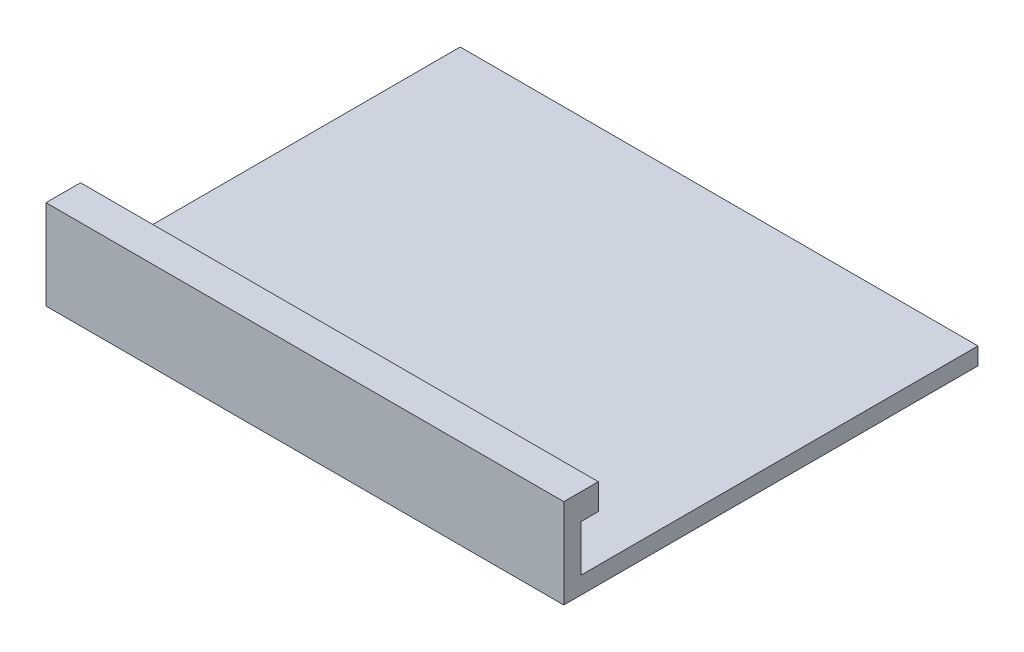
ISO-10303-21;
HEADER;
FILE_DESCRIPTION(('STEP AP214'),'2;1');
FILE_NAME('part.step','',(''),(''),'','','');
FILE_SCHEMA(('AUTOMOTIVE_DESIGN { 1 0 10303 214 1 1 1 1 }'));
ENDSEC;
DATA;
#1=APPLICATION_CONTEXT('core data for automotive mechanical design processes');
#2=APPLICATION_PROTOCOL_DEFINITION('international standard','automotive_design',2000,#1);
#3=PRODUCT_CONTEXT('',#1,'mechanical');
#4=PRODUCT('Part','Part','',(#3));
#5=PRODUCT_RELATED_PRODUCT_CATEGORY('part','',(#4));
#6=PRODUCT_DEFINITION_FORMATION('','',#4);
#7=PRODUCT_DEFINITION_CONTEXT('part definition',#1,'design');
#8=PRODUCT_DEFINITION('design','',#6,#7);
#9=PRODUCT_DEFINITION_SHAPE('','',#8);
#10=(LENGTH_UNIT() NAMED_UNIT(*) SI_UNIT(.MILLI.,.METRE.));
#11=(NAMED_UNIT(*) PLANE_ANGLE_UNIT() SI_UNIT($,.RADIAN.));
#12=(NAMED_UNIT(*) SI_UNIT($,.STERADIAN.) SOLID_ANGLE_UNIT());
#13=UNCERTAINTY_MEASURE_WITH_UNIT(LENGTH_MEASURE(1.E-05),#10,'distance_accuracy_value','');
#14=(GEOMETRIC_REPRESENTATION_CONTEXT(3) GLOBAL_UNCERTAINTY_ASSIGNED_CONTEXT((#13)) GLOBAL_UNIT_ASSIGNED_CONTEXT((#10,
#11,#12)) REPRESENTATION_CONTEXT('',''));
#15=CARTESIAN_POINT('',(0.,0.,0.));
#16=DIRECTION('',(0.,0.,1.));
#17=DIRECTION('',(1.,0.,0.));
#18=AXIS2_PLACEMENT_3D('',#15,#16,#17);
#19=CARTESIAN_POINT('',(762.,93.6625,558.8));
#20=DIRECTION('',(0.,1.,0.));
#21=DIRECTION('',(0.,0.,1.));
#22=AXIS2_PLACEMENT_3D('',#19,#20,#21);
#23=PLANE('',#22);
#24=DIRECTION('',(0.,0.,-1.));
#25=VECTOR('',#24,1.);
#26=CARTESIAN_POINT('',(0.,93.6625,558.8));
#27=LINE('',#26,#25);
#28=CARTESIAN_POINT('',(0.,93.6625,584.2));
#29=VERTEX_POINT('',#28);
#30=CARTESIAN_POINT('',(0.,93.6625,558.8));
#31=VERTEX_POINT('',#30);
#32=EDGE_CURVE('E135',#29,#31,#27,.T.);
#33=ORIENTED_EDGE('',*,*,#32,.T.);
#34=DIRECTION('',(-1.,0.,0.));
#35=VECTOR('',#34,1.);
#36=CARTESIAN_POINT('',(762.,93.6625,558.8));
#37=LINE('',#36,#35);
#38=CARTESIAN_POINT('',(762.,93.6625,558.8));
#39=VERTEX_POINT('',#38);
#40=EDGE_CURVE('E11',#39,#31,#37,.T.);
#41=ORIENTED_EDGE('',*,*,#40,.F.);
#42=DIRECTION('',(0.,0.,-1.));
#43=VECTOR('',#42,1.);
#44=CARTESIAN_POINT('',(762.,93.6625,558.8));
#45=LINE('',#44,#43);
#46=CARTESIAN_POINT('',(762.,93.6625,584.2));
#47=VERTEX_POINT('',#46);
#48=EDGE_CURVE('E149',#47,#39,#45,.T.);
#49=ORIENTED_EDGE('',*,*,#48,.F.);
#50=DIRECTION('',(-1.,0.,0.));
#51=VECTOR('',#50,1.);
#52=CARTESIAN_POINT('',(762.,93.6625,584.2));
#53=LINE('',#52,#51);
#54=EDGE_CURVE('E131',#47,#29,#53,.T.);
#55=ORIENTED_EDGE('',*,*,#54,.T.);
#56=EDGE_LOOP('',(#33,#41,#49,#55));
#57=FACE_BOUND('',#56,.T.);
#58=ADVANCED_FACE('F39',(#57),#23,.F.);
#59=CARTESIAN_POINT('',(762.,131.7625,558.8));
#60=DIRECTION('',(0.,0.,1.));
#61=DIRECTION('',(1.,0.,0.));
#62=AXIS2_PLACEMENT_3D('',#59,#60,#61);
#63=PLANE('',#62);
#64=DIRECTION('',(0.,1.,0.));
#65=VECTOR('',#64,1.);
#66=CARTESIAN_POINT('',(0.,131.7625,558.8));
#67=LINE('',#66,#65);
#68=CARTESIAN_POINT('',(0.,131.7625,558.8));
#69=VERTEX_POINT('',#68);
#70=EDGE_CURVE('E138',#31,#69,#67,.T.);
#71=ORIENTED_EDGE('',*,*,#70,.T.);
#72=DIRECTION('',(-1.,0.,0.));
#73=VECTOR('',#72,1.);
#74=CARTESIAN_POINT('',(762.,131.7625,558.8));
#75=LINE('',#74,#73);
#76=CARTESIAN_POINT('',(762.,131.7625,558.8));
#77=VERTEX_POINT('',#76);
#78=EDGE_CURVE('E47',#77,#69,#75,.T.);
#79=ORIENTED_EDGE('',*,*,#78,.F.);
#80=DIRECTION('',(0.,1.,0.));
#81=VECTOR('',#80,1.);
#82=CARTESIAN_POINT('',(762.,131.7625,558.8));
#83=LINE('',#82,#81);
#84=EDGE_CURVE('E98',#39,#77,#83,.T.);
#85=ORIENTED_EDGE('',*,*,#84,.F.);
#86=ORIENTED_EDGE('',*,*,#40,.T.);
#87=EDGE_LOOP('',(#71,#79,#85,#86));
#88=FACE_BOUND('',#87,.T.);
#89=ADVANCED_FACE('F184',(#88),#63,.F.);
#90=CARTESIAN_POINT('',(762.,131.7625,609.6));
#91=DIRECTION('',(0.,-1.,0.));
#92=DIRECTION('',(0.,0.,-1.));
#93=AXIS2_PLACEMENT_3D('',#90,#91,#92);
#94=PLANE('',#93);
#95=DIRECTION('',(0.,0.,1.));
#96=VECTOR('',#95,1.);
#97=CARTESIAN_POINT('',(0.,131.7625,609.6));
#98=LINE('',#97,#96);
#99=CARTESIAN_POINT('',(0.,131.7625,609.6));
#100=VERTEX_POINT('',#99);
#101=EDGE_CURVE('E140',#69,#100,#98,.T.);
#102=ORIENTED_EDGE('',*,*,#101,.T.);
#103=DIRECTION('',(-1.,0.,0.));
#104=VECTOR('',#103,1.);
#105=CARTESIAN_POINT('',(762.,131.7625,609.6));
#106=LINE('',#105,#104);
#107=CARTESIAN_POINT('',(762.,131.7625,609.6));
#108=VERTEX_POINT('',#107);
#109=EDGE_CURVE('E156',#108,#100,#106,.T.);
#110=ORIENTED_EDGE('',*,*,#109,.F.);
#111=DIRECTION('',(0.,0.,1.));
#112=VECTOR('',#111,1.);
#113=CARTESIAN_POINT('',(762.,131.7625,609.6));
#114=LINE('',#113,#112);
#115=EDGE_CURVE('E164',#77,#108,#114,.T.);
#116=ORIENTED_EDGE('',*,*,#115,.F.);
#117=ORIENTED_EDGE('',*,*,#78,.T.);
#118=EDGE_LOOP('',(#102,#110,#116,#117));
#119=FACE_BOUND('',#118,.T.);
#120=ADVANCED_FACE('F162',(#119),#94,.F.);
#121=CARTESIAN_POINT('',(762.,0.,609.6));
#122=DIRECTION('',(0.,0.,-1.));
#123=DIRECTION('',(-1.,0.,0.));
#124=AXIS2_PLACEMENT_3D('',#121,#122,#123);
#125=PLANE('',#124);
#126=DIRECTION('',(0.,-1.,0.));
#127=VECTOR('',#126,1.);
#128=CARTESIAN_POINT('',(0.,0.,609.6));
#129=LINE('',#128,#127);
#130=CARTESIAN_POINT('',(0.,0.,609.6));
#131=VERTEX_POINT('',#130);
#132=EDGE_CURVE('E142',#100,#131,#129,.T.);
#133=ORIENTED_EDGE('',*,*,#132,.T.);
#134=DIRECTION('',(-1.,0.,0.));
#135=VECTOR('',#134,1.);
#136=CARTESIAN_POINT('',(762.,0.,609.6));
#137=LINE('',#136,#135);
#138=CARTESIAN_POINT('',(762.,0.,609.6));
#139=VERTEX_POINT('',#138);
#140=EDGE_CURVE('E153',#139,#131,#137,.T.);
#141=ORIENTED_EDGE('',*,*,#140,.F.);
#142=DIRECTION('',(0.,-1.,0.));
#143=VECTOR('',#142,1.);
#144=CARTESIAN_POINT('',(762.,0.,609.6));
#145=LINE('',#144,#143);
#146=EDGE_CURVE('E176',#108,#139,#145,.T.);
#147=ORIENTED_EDGE('',*,*,#146,.F.);
#148=ORIENTED_EDGE('',*,*,#109,.T.);
#149=EDGE_LOOP('',(#133,#141,#147,#148));
#150=FACE_BOUND('',#149,.T.);
#151=ADVANCED_FACE('F172',(#150),#125,.F.);
#152=CARTESIAN_POINT('',(762.,0.,0.));
#153=DIRECTION('',(0.,1.,0.));
#154=DIRECTION('',(0.,0.,1.));
#155=AXIS2_PLACEMENT_3D('',#152,#153,#154);
#156=PLANE('',#155);
#157=DIRECTION('',(0.,0.,-1.));
#158=VECTOR('',#157,1.);
#159=CARTESIAN_POINT('',(0.,0.,0.));
#160=LINE('',#159,#158);
#161=CARTESIAN_POINT('',(0.,0.,0.));
#162=VERTEX_POINT('',#161);
#163=EDGE_CURVE('E144',#131,#162,#160,.T.);
#164=ORIENTED_EDGE('',*,*,#163,.T.);
#165=DIRECTION('',(-1.,0.,0.));
#166=VECTOR('',#165,1.);
#167=CARTESIAN_POINT('',(762.,0.,0.));
#168=LINE('',#167,#166);
#169=CARTESIAN_POINT('',(762.,0.,0.));
#170=VERTEX_POINT('',#169);
#171=EDGE_CURVE('E126',#170,#162,#168,.T.);
#172=ORIENTED_EDGE('',*,*,#171,.F.);
#173=DIRECTION('',(0.,0.,-1.));
#174=VECTOR('',#173,1.);
#175=CARTESIAN_POINT('',(762.,0.,0.));
#176=LINE('',#175,#174);
#177=EDGE_CURVE('E117',#139,#170,#176,.T.);
#178=ORIENTED_EDGE('',*,*,#177,.F.);
#179=ORIENTED_EDGE('',*,*,#140,.T.);
#180=EDGE_LOOP('',(#164,#172,#178,#179));
#181=FACE_BOUND('',#180,.T.);
#182=ADVANCED_FACE('F175',(#181),#156,.F.);
#183=CARTESIAN_POINT('',(762.,25.4,0.));
#184=DIRECTION('',(0.,0.,1.));
#185=DIRECTION('',(1.,0.,0.));
#186=AXIS2_PLACEMENT_3D('',#183,#184,#185);
#187=PLANE('',#186);
#188=DIRECTION('',(0.,1.,0.));
#189=VECTOR('',#188,1.);
#190=CARTESIAN_POINT('',(0.,25.4,0.));
#191=LINE('',#190,#189);
#192=CARTESIAN_POINT('',(0.,25.4,0.));
#193=VERTEX_POINT('',#192);
#194=EDGE_CURVE('E125',#162,#193,#191,.T.);
#195=ORIENTED_EDGE('',*,*,#194,.T.);
#196=DIRECTION('',(-1.,0.,0.));
#197=VECTOR('',#196,1.);
#198=CARTESIAN_POINT('',(762.,25.4,0.));
#199=LINE('',#198,#197);
#200=CARTESIAN_POINT('',(762.,25.4,0.));
#201=VERTEX_POINT('',#200);
#202=EDGE_CURVE('E122',#201,#193,#199,.T.);
#203=ORIENTED_EDGE('',*,*,#202,.F.);
#204=DIRECTION('',(0.,1.,0.));
#205=VECTOR('',#204,1.);
#206=CARTESIAN_POINT('',(762.,25.4,0.));
#207=LINE('',#206,#205);
#208=EDGE_CURVE('E111',#170,#201,#207,.T.);
#209=ORIENTED_EDGE('',*,*,#208,.F.);
#210=ORIENTED_EDGE('',*,*,#171,.T.);
#211=EDGE_LOOP('',(#195,#203,#209,#210));
#212=FACE_BOUND('',#211,.T.);
#213=ADVANCED_FACE('F123',(#212),#187,.F.);
#214=CARTESIAN_POINT('',(762.,25.4,584.2));
#215=DIRECTION('',(0.,-1.,0.));
#216=DIRECTION('',(0.,0.,-1.));
#217=AXIS2_PLACEMENT_3D('',#214,#215,#216);
#218=PLANE('',#217);
#219=DIRECTION('',(0.,0.,1.));
#220=VECTOR('',#219,1.);
#221=CARTESIAN_POINT('',(0.,25.4,584.2));
#222=LINE('',#221,#220);
#223=CARTESIAN_POINT('',(0.,25.4,584.2));
#224=VERTEX_POINT('',#223);
#225=EDGE_CURVE('E84',#193,#224,#222,.T.);
#226=ORIENTED_EDGE('',*,*,#225,.T.);
#227=DIRECTION('',(-1.,0.,0.));
#228=VECTOR('',#227,1.);
#229=CARTESIAN_POINT('',(762.,25.4,584.2));
#230=LINE('',#229,#228);
#231=CARTESIAN_POINT('',(762.,25.4,584.2));
#232=VERTEX_POINT('',#231);
#233=EDGE_CURVE('E127',#232,#224,#230,.T.);
#234=ORIENTED_EDGE('',*,*,#233,.F.);
#235=DIRECTION('',(0.,0.,1.));
#236=VECTOR('',#235,1.);
#237=CARTESIAN_POINT('',(762.,25.4,584.2));
#238=LINE('',#237,#236);
#239=EDGE_CURVE('E115',#201,#232,#238,.T.);
#240=ORIENTED_EDGE('',*,*,#239,.F.);
#241=ORIENTED_EDGE('',*,*,#202,.T.);
#242=EDGE_LOOP('',(#226,#234,#240,#241));
#243=FACE_BOUND('',#242,.T.);
#244=ADVANCED_FACE('F129',(#243),#218,.F.);
#245=CARTESIAN_POINT('',(762.,93.6625,584.2));
#246=DIRECTION('',(0.,0.,1.));
#247=DIRECTION('',(1.,0.,0.));
#248=AXIS2_PLACEMENT_3D('',#245,#246,#247);
#249=PLANE('',#248);
#250=DIRECTION('',(0.,1.,0.));
#251=VECTOR('',#250,1.);
#252=CARTESIAN_POINT('',(0.,93.6625,584.2));
#253=LINE('',#252,#251);
#254=EDGE_CURVE('E90',#224,#29,#253,.T.);
#255=ORIENTED_EDGE('',*,*,#254,.T.);
#256=ORIENTED_EDGE('',*,*,#54,.F.);
#257=DIRECTION('',(0.,1.,0.));
#258=VECTOR('',#257,1.);
#259=CARTESIAN_POINT('',(762.,93.6625,584.2));
#260=LINE('',#259,#258);
#261=EDGE_CURVE('E55',#232,#47,#260,.T.);
#262=ORIENTED_EDGE('',*,*,#261,.F.);
#263=ORIENTED_EDGE('',*,*,#233,.T.);
#264=EDGE_LOOP('',(#255,#256,#262,#263));
#265=FACE_BOUND('',#264,.T.);
#266=ADVANCED_FACE('F200',(#265),#249,.F.);
#267=CARTESIAN_POINT('',(762.,0.,0.));
#268=DIRECTION('',(1.,0.,0.));
#269=DIRECTION('',(0.,0.,-1.));
#270=AXIS2_PLACEMENT_3D('',#267,#268,#269);
#271=PLANE('',#270);
#272=ORIENTED_EDGE('',*,*,#48,.T.);
#273=ORIENTED_EDGE('',*,*,#84,.T.);
#274=ORIENTED_EDGE('',*,*,#115,.T.);
#275=ORIENTED_EDGE('',*,*,#146,.T.);
#276=ORIENTED_EDGE('',*,*,#177,.T.);
#277=ORIENTED_EDGE('',*,*,#208,.T.);
#278=ORIENTED_EDGE('',*,*,#239,.T.);
#279=ORIENTED_EDGE('',*,*,#261,.T.);
#280=EDGE_LOOP('',(#272,#273,#274,#275,#276,#277,#278,#279));
#281=FACE_BOUND('',#280,.T.);
#282=ADVANCED_FACE('F113',(#281),#271,.T.);
#283=CARTESIAN_POINT('',(0.,0.,0.));
#284=DIRECTION('',(1.,0.,0.));
#285=DIRECTION('',(0.,0.,-1.));
#286=AXIS2_PLACEMENT_3D('',#283,#284,#285);
#287=PLANE('',#286);
#288=ORIENTED_EDGE('',*,*,#32,.F.);
#289=ORIENTED_EDGE('',*,*,#254,.F.);
#290=ORIENTED_EDGE('',*,*,#225,.F.);
#291=ORIENTED_EDGE('',*,*,#194,.F.);
#292=ORIENTED_EDGE('',*,*,#163,.F.);
#293=ORIENTED_EDGE('',*,*,#132,.F.);
#294=ORIENTED_EDGE('',*,*,#101,.F.);
#295=ORIENTED_EDGE('',*,*,#70,.F.);
#296=EDGE_LOOP('',(#288,#289,#290,#291,#292,#293,#294,#295));
#297=FACE_BOUND('',#296,.T.);
#298=ADVANCED_FACE('F168',(#297),#287,.F.);
#299=CLOSED_SHELL('',(#58,#89,#120,#151,#182,#213,#244,#266,#282,#298));
#300=MANIFOLD_SOLID_BREP('B2',#299);
#301=ADVANCED_BREP_SHAPE_REPRESENTATION('',(#18,#300),#14);
#302=SHAPE_DEFINITION_REPRESENTATION(#9,#301);
ENDSEC;
END-ISO-10303-21;
